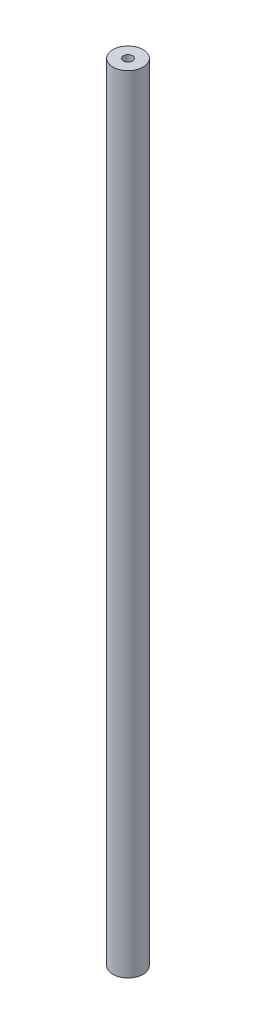
ISO-10303-21;
HEADER;
FILE_DESCRIPTION(('STEP AP214'),'2;1');
FILE_NAME('part.step','',(''),(''),'','','');
FILE_SCHEMA(('AUTOMOTIVE_DESIGN { 1 0 10303 214 1 1 1 1 }'));
ENDSEC;
DATA;
#1=APPLICATION_CONTEXT('core data for automotive mechanical design processes');
#2=APPLICATION_PROTOCOL_DEFINITION('international standard','automotive_design',2000,#1);
#3=PRODUCT_CONTEXT('',#1,'mechanical');
#4=PRODUCT('Part','Part','',(#3));
#5=PRODUCT_RELATED_PRODUCT_CATEGORY('part','',(#4));
#6=PRODUCT_DEFINITION_FORMATION('','',#4);
#7=PRODUCT_DEFINITION_CONTEXT('part definition',#1,'design');
#8=PRODUCT_DEFINITION('design','',#6,#7);
#9=PRODUCT_DEFINITION_SHAPE('','',#8);
#10=(LENGTH_UNIT() NAMED_UNIT(*) SI_UNIT(.MILLI.,.METRE.));
#11=(NAMED_UNIT(*) PLANE_ANGLE_UNIT() SI_UNIT($,.RADIAN.));
#12=(NAMED_UNIT(*) SI_UNIT($,.STERADIAN.) SOLID_ANGLE_UNIT());
#13=UNCERTAINTY_MEASURE_WITH_UNIT(LENGTH_MEASURE(1.E-05),#10,'distance_accuracy_value','');
#14=(GEOMETRIC_REPRESENTATION_CONTEXT(3) GLOBAL_UNCERTAINTY_ASSIGNED_CONTEXT((#13)) GLOBAL_UNIT_ASSIGNED_CONTEXT((#10,
#11,#12)) REPRESENTATION_CONTEXT('',''));
#15=CARTESIAN_POINT('',(0.,0.,0.));
#16=DIRECTION('',(0.,0.,1.));
#17=DIRECTION('',(1.,0.,0.));
#18=AXIS2_PLACEMENT_3D('',#15,#16,#17);
#19=CARTESIAN_POINT('',(0.,130.,0.));
#20=DIRECTION('',(0.,1.,0.));
#21=DIRECTION('',(0.,0.,1.));
#22=AXIS2_PLACEMENT_3D('',#19,#20,#21);
#23=PLANE('',#22);
#24=CARTESIAN_POINT('',(0.,130.,0.));
#25=DIRECTION('',(0.,1.,0.));
#26=DIRECTION('',(0.,0.,1.));
#27=AXIS2_PLACEMENT_3D('',#24,#25,#26);
#28=CIRCLE('',#27,2.5);
#29=CARTESIAN_POINT('',(0.,130.,2.5));
#30=VERTEX_POINT('',#29);
#31=EDGE_CURVE('E10',#30,#30,#28,.T.);
#32=ORIENTED_EDGE('',*,*,#31,.T.);
#33=EDGE_LOOP('',(#32));
#34=FACE_BOUND('',#33,.T.);
#35=CARTESIAN_POINT('',(0.,130.,0.));
#36=DIRECTION('',(0.,1.,0.));
#37=DIRECTION('',(0.,0.,1.));
#38=AXIS2_PLACEMENT_3D('',#35,#36,#37);
#39=CIRCLE('',#38,0.75);
#40=CARTESIAN_POINT('',(0.,130.,0.75));
#41=VERTEX_POINT('',#40);
#42=EDGE_CURVE('E42',#41,#41,#39,.T.);
#43=ORIENTED_EDGE('',*,*,#42,.F.);
#44=EDGE_LOOP('',(#43));
#45=FACE_BOUND('',#44,.T.);
#46=ADVANCED_FACE('F31',(#34,#45),#23,.T.);
#47=CARTESIAN_POINT('',(0.,0.,0.));
#48=DIRECTION('',(0.,1.,0.));
#49=DIRECTION('',(0.,0.,1.));
#50=AXIS2_PLACEMENT_3D('',#47,#48,#49);
#51=PLANE('',#50);
#52=CARTESIAN_POINT('',(0.,0.,0.));
#53=DIRECTION('',(0.,1.,0.));
#54=DIRECTION('',(0.,0.,1.));
#55=AXIS2_PLACEMENT_3D('',#52,#53,#54);
#56=CIRCLE('',#55,2.5);
#57=CARTESIAN_POINT('',(0.,0.,2.5));
#58=VERTEX_POINT('',#57);
#59=EDGE_CURVE('E35',#58,#58,#56,.T.);
#60=ORIENTED_EDGE('',*,*,#59,.F.);
#61=EDGE_LOOP('',(#60));
#62=FACE_BOUND('',#61,.T.);
#63=CARTESIAN_POINT('',(0.,0.,0.));
#64=DIRECTION('',(0.,1.,0.));
#65=DIRECTION('',(0.,0.,1.));
#66=AXIS2_PLACEMENT_3D('',#63,#64,#65);
#67=CIRCLE('',#66,0.75);
#68=CARTESIAN_POINT('',(0.,0.,0.75));
#69=VERTEX_POINT('',#68);
#70=EDGE_CURVE('E44',#69,#69,#67,.T.);
#71=ORIENTED_EDGE('',*,*,#70,.T.);
#72=EDGE_LOOP('',(#71));
#73=FACE_BOUND('',#72,.T.);
#74=ADVANCED_FACE('F54',(#62,#73),#51,.F.);
#75=CARTESIAN_POINT('',(0.,130.,0.));
#76=DIRECTION('',(0.,-1.,0.));
#77=DIRECTION('',(0.,0.,-1.));
#78=AXIS2_PLACEMENT_3D('',#75,#76,#77);
#79=CYLINDRICAL_SURFACE('',#78,2.5);
#80=ORIENTED_EDGE('',*,*,#31,.F.);
#81=EDGE_LOOP('',(#80));
#82=FACE_BOUND('',#81,.T.);
#83=ORIENTED_EDGE('',*,*,#59,.T.);
#84=EDGE_LOOP('',(#83));
#85=FACE_BOUND('',#84,.T.);
#86=ADVANCED_FACE('F33',(#82,#85),#79,.T.);
#87=CARTESIAN_POINT('',(0.,130.,0.));
#88=DIRECTION('',(0.,-1.,0.));
#89=DIRECTION('',(0.,0.,-1.));
#90=AXIS2_PLACEMENT_3D('',#87,#88,#89);
#91=CYLINDRICAL_SURFACE('',#90,0.75);
#92=ORIENTED_EDGE('',*,*,#42,.T.);
#93=EDGE_LOOP('',(#92));
#94=FACE_BOUND('',#93,.T.);
#95=ORIENTED_EDGE('',*,*,#70,.F.);
#96=EDGE_LOOP('',(#95));
#97=FACE_BOUND('',#96,.T.);
#98=ADVANCED_FACE('F50',(#94,#97),#91,.F.);
#99=CLOSED_SHELL('',(#46,#74,#86,#98));
#100=MANIFOLD_SOLID_BREP('B2',#99);
#101=ADVANCED_BREP_SHAPE_REPRESENTATION('',(#18,#100),#14);
#102=SHAPE_DEFINITION_REPRESENTATION(#9,#101);
ENDSEC;
END-ISO-10303-21;
